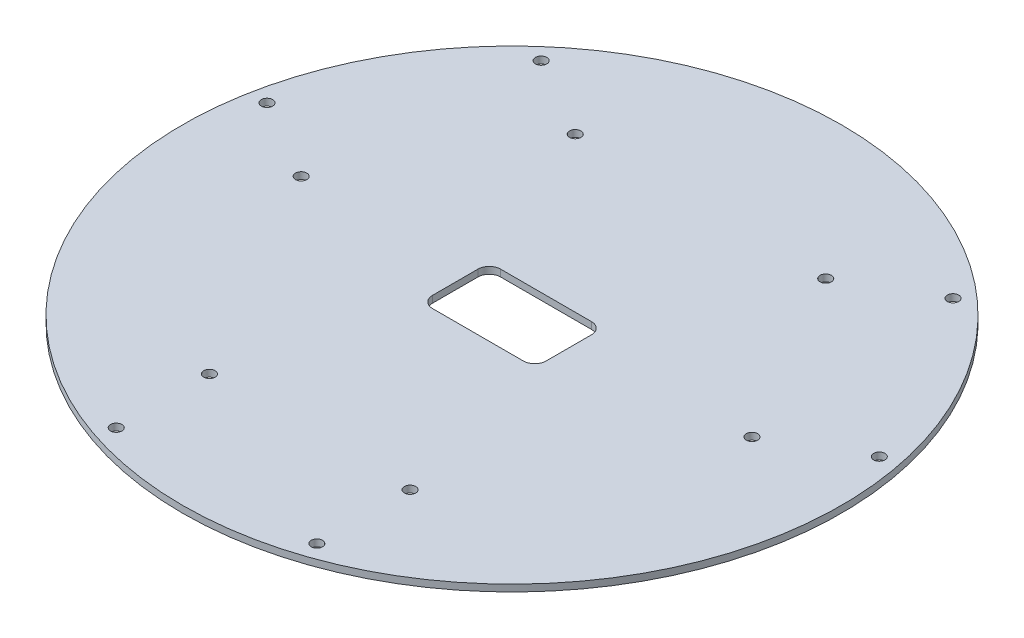
ISO-10303-21;
HEADER;
FILE_DESCRIPTION(('STEP AP214'),'2;1');
FILE_NAME('part.step','',(''),(''),'','','');
FILE_SCHEMA(('AUTOMOTIVE_DESIGN { 1 0 10303 214 1 1 1 1 }'));
ENDSEC;
DATA;
#1=APPLICATION_CONTEXT('core data for automotive mechanical design processes');
#2=APPLICATION_PROTOCOL_DEFINITION('international standard','automotive_design',2000,#1);
#3=PRODUCT_CONTEXT('',#1,'mechanical');
#4=PRODUCT('Part','Part','',(#3));
#5=PRODUCT_RELATED_PRODUCT_CATEGORY('part','',(#4));
#6=PRODUCT_DEFINITION_FORMATION('','',#4);
#7=PRODUCT_DEFINITION_CONTEXT('part definition',#1,'design');
#8=PRODUCT_DEFINITION('design','',#6,#7);
#9=PRODUCT_DEFINITION_SHAPE('','',#8);
#10=(LENGTH_UNIT() NAMED_UNIT(*) SI_UNIT(.MILLI.,.METRE.));
#11=(NAMED_UNIT(*) PLANE_ANGLE_UNIT() SI_UNIT($,.RADIAN.));
#12=(NAMED_UNIT(*) SI_UNIT($,.STERADIAN.) SOLID_ANGLE_UNIT());
#13=UNCERTAINTY_MEASURE_WITH_UNIT(LENGTH_MEASURE(1.E-05),#10,'distance_accuracy_value','');
#14=(GEOMETRIC_REPRESENTATION_CONTEXT(3) GLOBAL_UNCERTAINTY_ASSIGNED_CONTEXT((#13)) GLOBAL_UNIT_ASSIGNED_CONTEXT((#10,
#11,#12)) REPRESENTATION_CONTEXT('',''));
#15=CARTESIAN_POINT('',(0.,0.,0.));
#16=DIRECTION('',(0.,0.,1.));
#17=DIRECTION('',(1.,0.,0.));
#18=AXIS2_PLACEMENT_3D('',#15,#16,#17);
#19=CARTESIAN_POINT('',(0.,3.,0.));
#20=DIRECTION('',(0.,-1.,0.));
#21=DIRECTION('',(0.,0.,-1.));
#22=AXIS2_PLACEMENT_3D('',#19,#20,#21);
#23=CYLINDRICAL_SURFACE('',#22,145.);
#24=CARTESIAN_POINT('',(0.,3.,0.));
#25=DIRECTION('',(0.,1.,0.));
#26=DIRECTION('',(0.,0.,1.));
#27=AXIS2_PLACEMENT_3D('',#24,#25,#26);
#28=CIRCLE('',#27,145.);
#29=CARTESIAN_POINT('',(0.,3.,145.));
#30=VERTEX_POINT('',#29);
#31=EDGE_CURVE('E180',#30,#30,#28,.T.);
#32=ORIENTED_EDGE('',*,*,#31,.F.);
#33=EDGE_LOOP('',(#32));
#34=FACE_BOUND('',#33,.T.);
#35=CARTESIAN_POINT('',(0.,0.,0.));
#36=DIRECTION('',(0.,1.,0.));
#37=DIRECTION('',(0.,0.,1.));
#38=AXIS2_PLACEMENT_3D('',#35,#36,#37);
#39=CIRCLE('',#38,145.);
#40=CARTESIAN_POINT('',(0.,0.,145.));
#41=VERTEX_POINT('',#40);
#42=EDGE_CURVE('E184',#41,#41,#39,.T.);
#43=ORIENTED_EDGE('',*,*,#42,.T.);
#44=EDGE_LOOP('',(#43));
#45=FACE_BOUND('',#44,.T.);
#46=ADVANCED_FACE('F36',(#34,#45),#23,.T.);
#47=CARTESIAN_POINT('',(0.,3.,0.));
#48=DIRECTION('',(0.,1.,0.));
#49=DIRECTION('',(0.,0.,1.));
#50=AXIS2_PLACEMENT_3D('',#47,#48,#49);
#51=PLANE('',#50);
#52=DIRECTION('',(0.,0.,-1.));
#53=VECTOR('',#52,1.);
#54=CARTESIAN_POINT('',(25.,3.,-15.));
#55=LINE('',#54,#53);
#56=CARTESIAN_POINT('',(25.,3.,9.99999999999999));
#57=VERTEX_POINT('',#56);
#58=CARTESIAN_POINT('',(25.,3.,-10.));
#59=VERTEX_POINT('',#58);
#60=EDGE_CURVE('E132',#57,#59,#55,.T.);
#61=ORIENTED_EDGE('',*,*,#60,.F.);
#62=CARTESIAN_POINT('',(20.,3.,10.));
#63=DIRECTION('',(0.,1.,0.));
#64=DIRECTION('',(0.,0.,1.));
#65=AXIS2_PLACEMENT_3D('',#62,#63,#64);
#66=CIRCLE('',#65,5.);
#67=CARTESIAN_POINT('',(20.,3.,15.));
#68=VERTEX_POINT('',#67);
#69=EDGE_CURVE('E240',#57,#68,#66,.F.);
#70=ORIENTED_EDGE('',*,*,#69,.T.);
#71=DIRECTION('',(1.,0.,0.));
#72=VECTOR('',#71,1.);
#73=CARTESIAN_POINT('',(-25.,3.,15.));
#74=LINE('',#73,#72);
#75=CARTESIAN_POINT('',(-20.,3.,15.));
#76=VERTEX_POINT('',#75);
#77=EDGE_CURVE('E127',#76,#68,#74,.T.);
#78=ORIENTED_EDGE('',*,*,#77,.F.);
#79=CARTESIAN_POINT('',(-20.,3.,10.));
#80=DIRECTION('',(0.,1.,0.));
#81=DIRECTION('',(0.,0.,1.));
#82=AXIS2_PLACEMENT_3D('',#79,#80,#81);
#83=CIRCLE('',#82,5.);
#84=CARTESIAN_POINT('',(-25.,3.,10.));
#85=VERTEX_POINT('',#84);
#86=EDGE_CURVE('E44',#76,#85,#83,.F.);
#87=ORIENTED_EDGE('',*,*,#86,.T.);
#88=DIRECTION('',(0.,0.,1.));
#89=VECTOR('',#88,1.);
#90=CARTESIAN_POINT('',(-25.,3.,-15.));
#91=LINE('',#90,#89);
#92=CARTESIAN_POINT('',(-25.,3.,-10.));
#93=VERTEX_POINT('',#92);
#94=EDGE_CURVE('E117',#93,#85,#91,.T.);
#95=ORIENTED_EDGE('',*,*,#94,.F.);
#96=CARTESIAN_POINT('',(-20.,3.,-10.));
#97=DIRECTION('',(0.,1.,0.));
#98=DIRECTION('',(0.,0.,1.));
#99=AXIS2_PLACEMENT_3D('',#96,#97,#98);
#100=CIRCLE('',#99,5.);
#101=CARTESIAN_POINT('',(-20.,3.,-15.));
#102=VERTEX_POINT('',#101);
#103=EDGE_CURVE('E101',#93,#102,#100,.F.);
#104=ORIENTED_EDGE('',*,*,#103,.T.);
#105=DIRECTION('',(-1.,0.,0.));
#106=VECTOR('',#105,1.);
#107=CARTESIAN_POINT('',(-25.,3.,-15.));
#108=LINE('',#107,#106);
#109=CARTESIAN_POINT('',(20.,3.,-15.));
#110=VERTEX_POINT('',#109);
#111=EDGE_CURVE('E128',#110,#102,#108,.T.);
#112=ORIENTED_EDGE('',*,*,#111,.F.);
#113=CARTESIAN_POINT('',(20.,3.,-10.));
#114=DIRECTION('',(0.,1.,0.));
#115=DIRECTION('',(0.,0.,1.));
#116=AXIS2_PLACEMENT_3D('',#113,#114,#115);
#117=CIRCLE('',#116,5.);
#118=EDGE_CURVE('E236',#110,#59,#117,.F.);
#119=ORIENTED_EDGE('',*,*,#118,.T.);
#120=EDGE_LOOP('',(#61,#70,#78,#87,#95,#104,#112,#119));
#121=FACE_BOUND('',#120,.T.);
#122=CARTESIAN_POINT('',(134.746567452598,3.,-26.8527252769548));
#123=DIRECTION('',(0.,1.,0.));
#124=DIRECTION('',(0.866025403784436,0.,-0.500000000000004));
#125=AXIS2_PLACEMENT_3D('',#122,#123,#124);
#126=CIRCLE('',#125,2.5);
#127=CARTESIAN_POINT('',(136.911630962059,3.,-28.1027252769548));
#128=VERTEX_POINT('',#127);
#129=EDGE_CURVE('E136',#128,#128,#126,.T.);
#130=ORIENTED_EDGE('',*,*,#129,.F.);
#131=EDGE_LOOP('',(#130));
#132=FACE_BOUND('',#131,.T.);
#133=CARTESIAN_POINT('',(-55.0256194612035,3.,-82.8423443212064));
#134=DIRECTION('',(0.,1.,0.));
#135=DIRECTION('',(-0.866025403784443,0.,-0.499999999999992));
#136=AXIS2_PLACEMENT_3D('',#133,#134,#135);
#137=CIRCLE('',#136,2.5);
#138=CARTESIAN_POINT('',(-57.1906829706646,3.,-84.0923443212064));
#139=VERTEX_POINT('',#138);
#140=EDGE_CURVE('E130',#139,#139,#137,.T.);
#141=ORIENTED_EDGE('',*,*,#140,.F.);
#142=EDGE_LOOP('',(#141));
#143=FACE_BOUND('',#142,.T.);
#144=CARTESIAN_POINT('',(-90.5326610163657,3.,-103.342344321206));
#145=DIRECTION('',(0.,1.,0.));
#146=DIRECTION('',(-0.866025403784443,0.,-0.499999999999992));
#147=AXIS2_PLACEMENT_3D('',#144,#145,#146);
#148=CIRCLE('',#147,2.5);
#149=CARTESIAN_POINT('',(-92.6977245258268,3.,-104.592344321206));
#150=VERTEX_POINT('',#149);
#151=EDGE_CURVE('E143',#150,#150,#148,.T.);
#152=ORIENTED_EDGE('',*,*,#151,.F.);
#153=EDGE_LOOP('',(#152));
#154=FACE_BOUND('',#153,.T.);
#155=CARTESIAN_POINT('',(99.2395258974363,3.,-6.35272527695467));
#156=DIRECTION('',(0.,1.,0.));
#157=DIRECTION('',(0.866025403784436,0.,-0.500000000000004));
#158=AXIS2_PLACEMENT_3D('',#155,#156,#157);
#159=CIRCLE('',#158,2.5);
#160=CARTESIAN_POINT('',(101.404589406897,3.,-7.60272527695468));
#161=VERTEX_POINT('',#160);
#162=EDGE_CURVE('E140',#161,#161,#159,.T.);
#163=ORIENTED_EDGE('',*,*,#162,.F.);
#164=EDGE_LOOP('',(#163));
#165=FACE_BOUND('',#164,.T.);
#166=CARTESIAN_POINT('',(-134.763695089256,3.,-26.9735045182583));
#167=DIRECTION('',(0.,-1.,0.));
#168=DIRECTION('',(-0.866025403784443,0.,-0.499999999999992));
#169=AXIS2_PLACEMENT_3D('',#166,#167,#168);
#170=CIRCLE('',#169,2.5);
#171=CARTESIAN_POINT('',(-136.928758598717,3.,-28.2235045182582));
#172=VERTEX_POINT('',#171);
#173=EDGE_CURVE('E148',#172,#172,#170,.T.);
#174=ORIENTED_EDGE('',*,*,#173,.T.);
#175=EDGE_LOOP('',(#174));
#176=FACE_BOUND('',#175,.T.);
#177=CARTESIAN_POINT('',(-99.2566535340941,3.,-6.47350451825859));
#178=DIRECTION('',(0.,-1.,0.));
#179=DIRECTION('',(-0.866025403784443,0.,-0.499999999999992));
#180=AXIS2_PLACEMENT_3D('',#177,#178,#179);
#181=CIRCLE('',#180,2.5);
#182=CARTESIAN_POINT('',(-101.421717043555,3.,-7.72350451825857));
#183=VERTEX_POINT('',#182);
#184=EDGE_CURVE('E152',#183,#183,#181,.T.);
#185=ORIENTED_EDGE('',*,*,#184,.T.);
#186=EDGE_LOOP('',(#185));
#187=FACE_BOUND('',#186,.T.);
#188=CARTESIAN_POINT('',(90.6286950892556,3.,-103.417566910312));
#189=DIRECTION('',(0.,-1.,0.));
#190=DIRECTION('',(0.866025403784436,0.,-0.500000000000004));
#191=AXIS2_PLACEMENT_3D('',#188,#189,#190);
#192=CIRCLE('',#191,2.5);
#193=CARTESIAN_POINT('',(92.7937585987167,3.,-104.667566910312));
#194=VERTEX_POINT('',#193);
#195=EDGE_CURVE('E156',#194,#194,#192,.T.);
#196=ORIENTED_EDGE('',*,*,#195,.T.);
#197=EDGE_LOOP('',(#196));
#198=FACE_BOUND('',#197,.T.);
#199=CARTESIAN_POINT('',(55.1216535340937,3.,-82.9175669103122));
#200=DIRECTION('',(0.,-1.,0.));
#201=DIRECTION('',(0.866025403784436,0.,-0.500000000000004));
#202=AXIS2_PLACEMENT_3D('',#199,#200,#201);
#203=CIRCLE('',#202,2.5);
#204=CARTESIAN_POINT('',(57.2867170435548,3.,-84.1675669103122));
#205=VERTEX_POINT('',#204);
#206=EDGE_CURVE('E160',#205,#205,#203,.T.);
#207=ORIENTED_EDGE('',*,*,#206,.T.);
#208=EDGE_LOOP('',(#207));
#209=FACE_BOUND('',#208,.T.);
#210=CARTESIAN_POINT('',(44.135,3.,130.));
#211=DIRECTION('',(0.,-1.,0.));
#212=DIRECTION('',(0.,0.,1.));
#213=AXIS2_PLACEMENT_3D('',#210,#211,#212);
#214=CIRCLE('',#213,2.5);
#215=CARTESIAN_POINT('',(44.135,3.,132.5));
#216=VERTEX_POINT('',#215);
#217=EDGE_CURVE('E164',#216,#216,#214,.T.);
#218=ORIENTED_EDGE('',*,*,#217,.T.);
#219=EDGE_LOOP('',(#218));
#220=FACE_BOUND('',#219,.T.);
#221=CARTESIAN_POINT('',(44.135,3.,89.));
#222=DIRECTION('',(0.,-1.,0.));
#223=DIRECTION('',(0.,0.,1.));
#224=AXIS2_PLACEMENT_3D('',#221,#222,#223);
#225=CIRCLE('',#224,2.5);
#226=CARTESIAN_POINT('',(44.135,3.,91.5));
#227=VERTEX_POINT('',#226);
#228=EDGE_CURVE('E168',#227,#227,#225,.T.);
#229=ORIENTED_EDGE('',*,*,#228,.T.);
#230=EDGE_LOOP('',(#229));
#231=FACE_BOUND('',#230,.T.);
#232=CARTESIAN_POINT('',(-44.135,3.,130.));
#233=DIRECTION('',(0.,1.,0.));
#234=DIRECTION('',(0.,0.,1.));
#235=AXIS2_PLACEMENT_3D('',#232,#233,#234);
#236=CIRCLE('',#235,2.5);
#237=CARTESIAN_POINT('',(-44.135,3.,132.5));
#238=VERTEX_POINT('',#237);
#239=EDGE_CURVE('E172',#238,#238,#236,.T.);
#240=ORIENTED_EDGE('',*,*,#239,.F.);
#241=EDGE_LOOP('',(#240));
#242=FACE_BOUND('',#241,.T.);
#243=CARTESIAN_POINT('',(-44.135,3.,89.));
#244=DIRECTION('',(0.,1.,0.));
#245=DIRECTION('',(0.,0.,1.));
#246=AXIS2_PLACEMENT_3D('',#243,#244,#245);
#247=CIRCLE('',#246,2.5);
#248=CARTESIAN_POINT('',(-44.135,3.,91.5));
#249=VERTEX_POINT('',#248);
#250=EDGE_CURVE('E176',#249,#249,#247,.T.);
#251=ORIENTED_EDGE('',*,*,#250,.F.);
#252=EDGE_LOOP('',(#251));
#253=FACE_BOUND('',#252,.T.);
#254=ORIENTED_EDGE('',*,*,#31,.T.);
#255=EDGE_LOOP('',(#254));
#256=FACE_BOUND('',#255,.T.);
#257=ADVANCED_FACE('F124',(#121,#132,#143,#154,#165,#176,#187,#198,#209,#220,#231,#242,#253,
#256),#51,.T.);
#258=CARTESIAN_POINT('',(0.,0.,0.));
#259=DIRECTION('',(0.,1.,0.));
#260=DIRECTION('',(0.,0.,1.));
#261=AXIS2_PLACEMENT_3D('',#258,#259,#260);
#262=PLANE('',#261);
#263=DIRECTION('',(0.,0.,1.));
#264=VECTOR('',#263,1.);
#265=CARTESIAN_POINT('',(-25.,0.,0.));
#266=LINE('',#265,#264);
#267=CARTESIAN_POINT('',(-25.,0.,-10.));
#268=VERTEX_POINT('',#267);
#269=CARTESIAN_POINT('',(-25.,0.,10.));
#270=VERTEX_POINT('',#269);
#271=EDGE_CURVE('E119',#268,#270,#266,.T.);
#272=ORIENTED_EDGE('',*,*,#271,.T.);
#273=CARTESIAN_POINT('',(-20.,0.,10.));
#274=DIRECTION('',(0.,1.,0.));
#275=DIRECTION('',(0.,0.,1.));
#276=AXIS2_PLACEMENT_3D('',#273,#274,#275);
#277=CIRCLE('',#276,5.);
#278=CARTESIAN_POINT('',(-20.,0.,15.));
#279=VERTEX_POINT('',#278);
#280=EDGE_CURVE('E11',#270,#279,#277,.T.);
#281=ORIENTED_EDGE('',*,*,#280,.T.);
#282=DIRECTION('',(1.,0.,0.));
#283=VECTOR('',#282,1.);
#284=CARTESIAN_POINT('',(0.,0.,15.));
#285=LINE('',#284,#283);
#286=CARTESIAN_POINT('',(20.,0.,15.));
#287=VERTEX_POINT('',#286);
#288=EDGE_CURVE('E217',#279,#287,#285,.T.);
#289=ORIENTED_EDGE('',*,*,#288,.T.);
#290=CARTESIAN_POINT('',(20.,0.,10.));
#291=DIRECTION('',(0.,1.,0.));
#292=DIRECTION('',(0.,0.,1.));
#293=AXIS2_PLACEMENT_3D('',#290,#291,#292);
#294=CIRCLE('',#293,5.);
#295=CARTESIAN_POINT('',(25.,0.,9.99999999999999));
#296=VERTEX_POINT('',#295);
#297=EDGE_CURVE('E242',#287,#296,#294,.T.);
#298=ORIENTED_EDGE('',*,*,#297,.T.);
#299=DIRECTION('',(0.,0.,-1.));
#300=VECTOR('',#299,1.);
#301=CARTESIAN_POINT('',(25.,0.,0.));
#302=LINE('',#301,#300);
#303=CARTESIAN_POINT('',(25.,0.,-10.));
#304=VERTEX_POINT('',#303);
#305=EDGE_CURVE('E219',#296,#304,#302,.T.);
#306=ORIENTED_EDGE('',*,*,#305,.T.);
#307=CARTESIAN_POINT('',(20.,0.,-10.));
#308=DIRECTION('',(0.,1.,0.));
#309=DIRECTION('',(0.,0.,1.));
#310=AXIS2_PLACEMENT_3D('',#307,#308,#309);
#311=CIRCLE('',#310,5.);
#312=CARTESIAN_POINT('',(20.,0.,-15.));
#313=VERTEX_POINT('',#312);
#314=EDGE_CURVE('E238',#304,#313,#311,.T.);
#315=ORIENTED_EDGE('',*,*,#314,.T.);
#316=DIRECTION('',(-1.,0.,0.));
#317=VECTOR('',#316,1.);
#318=CARTESIAN_POINT('',(0.,0.,-15.));
#319=LINE('',#318,#317);
#320=CARTESIAN_POINT('',(-20.,0.,-15.));
#321=VERTEX_POINT('',#320);
#322=EDGE_CURVE('E183',#313,#321,#319,.T.);
#323=ORIENTED_EDGE('',*,*,#322,.T.);
#324=CARTESIAN_POINT('',(-20.,0.,-10.));
#325=DIRECTION('',(0.,1.,0.));
#326=DIRECTION('',(0.,0.,1.));
#327=AXIS2_PLACEMENT_3D('',#324,#325,#326);
#328=CIRCLE('',#327,5.);
#329=EDGE_CURVE('E111',#321,#268,#328,.T.);
#330=ORIENTED_EDGE('',*,*,#329,.T.);
#331=EDGE_LOOP('',(#272,#281,#289,#298,#306,#315,#323,#330));
#332=FACE_BOUND('',#331,.T.);
#333=CARTESIAN_POINT('',(134.746567452598,0.,-26.8527252769548));
#334=DIRECTION('',(0.,1.,0.));
#335=DIRECTION('',(0.,0.,1.));
#336=AXIS2_PLACEMENT_3D('',#333,#334,#335);
#337=CIRCLE('',#336,2.5);
#338=CARTESIAN_POINT('',(134.746567452598,0.,-24.3527252769548));
#339=VERTEX_POINT('',#338);
#340=EDGE_CURVE('E155',#339,#339,#337,.T.);
#341=ORIENTED_EDGE('',*,*,#340,.T.);
#342=EDGE_LOOP('',(#341));
#343=FACE_BOUND('',#342,.T.);
#344=CARTESIAN_POINT('',(-55.0256194612035,0.,-82.8423443212064));
#345=DIRECTION('',(0.,1.,0.));
#346=DIRECTION('',(0.,0.,1.));
#347=AXIS2_PLACEMENT_3D('',#344,#345,#346);
#348=CIRCLE('',#347,2.5);
#349=CARTESIAN_POINT('',(-55.0256194612035,0.,-80.3423443212064));
#350=VERTEX_POINT('',#349);
#351=EDGE_CURVE('E209',#350,#350,#348,.T.);
#352=ORIENTED_EDGE('',*,*,#351,.T.);
#353=EDGE_LOOP('',(#352));
#354=FACE_BOUND('',#353,.T.);
#355=CARTESIAN_POINT('',(-90.5326610163657,0.,-103.342344321206));
#356=DIRECTION('',(0.,1.,0.));
#357=DIRECTION('',(0.,0.,1.));
#358=AXIS2_PLACEMENT_3D('',#355,#356,#357);
#359=CIRCLE('',#358,2.5);
#360=CARTESIAN_POINT('',(-90.5326610163657,0.,-100.842344321206));
#361=VERTEX_POINT('',#360);
#362=EDGE_CURVE('E206',#361,#361,#359,.T.);
#363=ORIENTED_EDGE('',*,*,#362,.T.);
#364=EDGE_LOOP('',(#363));
#365=FACE_BOUND('',#364,.T.);
#366=CARTESIAN_POINT('',(99.2395258974363,0.,-6.35272527695467));
#367=DIRECTION('',(0.,1.,0.));
#368=DIRECTION('',(0.,0.,1.));
#369=AXIS2_PLACEMENT_3D('',#366,#367,#368);
#370=CIRCLE('',#369,2.5);
#371=CARTESIAN_POINT('',(99.2395258974363,0.,-3.85272527695466));
#372=VERTEX_POINT('',#371);
#373=EDGE_CURVE('E139',#372,#372,#370,.T.);
#374=ORIENTED_EDGE('',*,*,#373,.T.);
#375=EDGE_LOOP('',(#374));
#376=FACE_BOUND('',#375,.T.);
#377=CARTESIAN_POINT('',(-134.763695089256,0.,-26.9735045182583));
#378=DIRECTION('',(0.,1.,0.));
#379=DIRECTION('',(0.,0.,1.));
#380=AXIS2_PLACEMENT_3D('',#377,#378,#379);
#381=CIRCLE('',#380,2.5);
#382=CARTESIAN_POINT('',(-134.763695089256,0.,-24.4735045182583));
#383=VERTEX_POINT('',#382);
#384=EDGE_CURVE('E163',#383,#383,#381,.F.);
#385=ORIENTED_EDGE('',*,*,#384,.F.);
#386=EDGE_LOOP('',(#385));
#387=FACE_BOUND('',#386,.T.);
#388=CARTESIAN_POINT('',(-99.2566535340941,0.,-6.47350451825859));
#389=DIRECTION('',(0.,1.,0.));
#390=DIRECTION('',(0.,0.,1.));
#391=AXIS2_PLACEMENT_3D('',#388,#389,#390);
#392=CIRCLE('',#391,2.5);
#393=CARTESIAN_POINT('',(-99.2566535340941,0.,-3.97350451825859));
#394=VERTEX_POINT('',#393);
#395=EDGE_CURVE('E151',#394,#394,#392,.F.);
#396=ORIENTED_EDGE('',*,*,#395,.F.);
#397=EDGE_LOOP('',(#396));
#398=FACE_BOUND('',#397,.T.);
#399=CARTESIAN_POINT('',(90.6286950892556,0.,-103.417566910312));
#400=DIRECTION('',(0.,1.,0.));
#401=DIRECTION('',(0.,0.,1.));
#402=AXIS2_PLACEMENT_3D('',#399,#400,#401);
#403=CIRCLE('',#402,2.5);
#404=CARTESIAN_POINT('',(90.6286950892556,0.,-100.917566910312));
#405=VERTEX_POINT('',#404);
#406=EDGE_CURVE('E171',#405,#405,#403,.F.);
#407=ORIENTED_EDGE('',*,*,#406,.F.);
#408=EDGE_LOOP('',(#407));
#409=FACE_BOUND('',#408,.T.);
#410=CARTESIAN_POINT('',(55.1216535340937,0.,-82.9175669103122));
#411=DIRECTION('',(0.,1.,0.));
#412=DIRECTION('',(0.,0.,1.));
#413=AXIS2_PLACEMENT_3D('',#410,#411,#412);
#414=CIRCLE('',#413,2.5);
#415=CARTESIAN_POINT('',(55.1216535340937,0.,-80.4175669103122));
#416=VERTEX_POINT('',#415);
#417=EDGE_CURVE('E159',#416,#416,#414,.F.);
#418=ORIENTED_EDGE('',*,*,#417,.F.);
#419=EDGE_LOOP('',(#418));
#420=FACE_BOUND('',#419,.T.);
#421=CARTESIAN_POINT('',(44.135,0.,130.));
#422=DIRECTION('',(0.,1.,0.));
#423=DIRECTION('',(0.,0.,1.));
#424=AXIS2_PLACEMENT_3D('',#421,#422,#423);
#425=CIRCLE('',#424,2.5);
#426=CARTESIAN_POINT('',(44.135,0.,132.5));
#427=VERTEX_POINT('',#426);
#428=EDGE_CURVE('E179',#427,#427,#425,.F.);
#429=ORIENTED_EDGE('',*,*,#428,.F.);
#430=EDGE_LOOP('',(#429));
#431=FACE_BOUND('',#430,.T.);
#432=CARTESIAN_POINT('',(44.135,0.,89.));
#433=DIRECTION('',(0.,1.,0.));
#434=DIRECTION('',(0.,0.,1.));
#435=AXIS2_PLACEMENT_3D('',#432,#433,#434);
#436=CIRCLE('',#435,2.5);
#437=CARTESIAN_POINT('',(44.135,0.,91.5));
#438=VERTEX_POINT('',#437);
#439=EDGE_CURVE('E167',#438,#438,#436,.F.);
#440=ORIENTED_EDGE('',*,*,#439,.F.);
#441=EDGE_LOOP('',(#440));
#442=FACE_BOUND('',#441,.T.);
#443=CARTESIAN_POINT('',(-44.135,0.,130.));
#444=DIRECTION('',(0.,1.,0.));
#445=DIRECTION('',(0.,0.,1.));
#446=AXIS2_PLACEMENT_3D('',#443,#444,#445);
#447=CIRCLE('',#446,2.5);
#448=CARTESIAN_POINT('',(-44.135,0.,132.5));
#449=VERTEX_POINT('',#448);
#450=EDGE_CURVE('E187',#449,#449,#447,.T.);
#451=ORIENTED_EDGE('',*,*,#450,.T.);
#452=EDGE_LOOP('',(#451));
#453=FACE_BOUND('',#452,.T.);
#454=CARTESIAN_POINT('',(-44.135,0.,89.));
#455=DIRECTION('',(0.,1.,0.));
#456=DIRECTION('',(0.,0.,1.));
#457=AXIS2_PLACEMENT_3D('',#454,#455,#456);
#458=CIRCLE('',#457,2.5);
#459=CARTESIAN_POINT('',(-44.135,0.,91.5));
#460=VERTEX_POINT('',#459);
#461=EDGE_CURVE('E175',#460,#460,#458,.T.);
#462=ORIENTED_EDGE('',*,*,#461,.T.);
#463=EDGE_LOOP('',(#462));
#464=FACE_BOUND('',#463,.T.);
#465=ORIENTED_EDGE('',*,*,#42,.F.);
#466=EDGE_LOOP('',(#465));
#467=FACE_BOUND('',#466,.T.);
#468=ADVANCED_FACE('F245',(#332,#343,#354,#365,#376,#387,#398,#409,#420,#431,#442,#453,#464,
#467),#262,.F.);
#469=CARTESIAN_POINT('',(-44.135,-7.,89.));
#470=DIRECTION('',(0.,1.,0.));
#471=DIRECTION('',(0.,0.,1.));
#472=AXIS2_PLACEMENT_3D('',#469,#470,#471);
#473=CYLINDRICAL_SURFACE('',#472,2.5);
#474=ORIENTED_EDGE('',*,*,#250,.T.);
#475=EDGE_LOOP('',(#474));
#476=FACE_BOUND('',#475,.T.);
#477=ORIENTED_EDGE('',*,*,#461,.F.);
#478=EDGE_LOOP('',(#477));
#479=FACE_BOUND('',#478,.T.);
#480=ADVANCED_FACE('F282',(#476,#479),#473,.F.);
#481=CARTESIAN_POINT('',(-44.135,-7.,130.));
#482=DIRECTION('',(0.,1.,0.));
#483=DIRECTION('',(0.,0.,1.));
#484=AXIS2_PLACEMENT_3D('',#481,#482,#483);
#485=CYLINDRICAL_SURFACE('',#484,2.5);
#486=ORIENTED_EDGE('',*,*,#239,.T.);
#487=EDGE_LOOP('',(#486));
#488=FACE_BOUND('',#487,.T.);
#489=ORIENTED_EDGE('',*,*,#450,.F.);
#490=EDGE_LOOP('',(#489));
#491=FACE_BOUND('',#490,.T.);
#492=ADVANCED_FACE('F286',(#488,#491),#485,.F.);
#493=CARTESIAN_POINT('',(44.135,-7.,89.));
#494=DIRECTION('',(0.,1.,0.));
#495=DIRECTION('',(0.,0.,1.));
#496=AXIS2_PLACEMENT_3D('',#493,#494,#495);
#497=CYLINDRICAL_SURFACE('',#496,2.5);
#498=ORIENTED_EDGE('',*,*,#228,.F.);
#499=EDGE_LOOP('',(#498));
#500=FACE_BOUND('',#499,.T.);
#501=ORIENTED_EDGE('',*,*,#439,.T.);
#502=EDGE_LOOP('',(#501));
#503=FACE_BOUND('',#502,.T.);
#504=ADVANCED_FACE('F290',(#500,#503),#497,.F.);
#505=CARTESIAN_POINT('',(44.135,-7.,130.));
#506=DIRECTION('',(0.,1.,0.));
#507=DIRECTION('',(0.,0.,1.));
#508=AXIS2_PLACEMENT_3D('',#505,#506,#507);
#509=CYLINDRICAL_SURFACE('',#508,2.5);
#510=ORIENTED_EDGE('',*,*,#217,.F.);
#511=EDGE_LOOP('',(#510));
#512=FACE_BOUND('',#511,.T.);
#513=ORIENTED_EDGE('',*,*,#428,.T.);
#514=EDGE_LOOP('',(#513));
#515=FACE_BOUND('',#514,.T.);
#516=ADVANCED_FACE('F294',(#512,#515),#509,.F.);
#517=CARTESIAN_POINT('',(55.1216535340937,-7.,-82.9175669103122));
#518=DIRECTION('',(0.,1.,0.));
#519=DIRECTION('',(0.,0.,1.));
#520=AXIS2_PLACEMENT_3D('',#517,#518,#519);
#521=CYLINDRICAL_SURFACE('',#520,2.5);
#522=ORIENTED_EDGE('',*,*,#206,.F.);
#523=EDGE_LOOP('',(#522));
#524=FACE_BOUND('',#523,.T.);
#525=ORIENTED_EDGE('',*,*,#417,.T.);
#526=EDGE_LOOP('',(#525));
#527=FACE_BOUND('',#526,.T.);
#528=ADVANCED_FACE('F298',(#524,#527),#521,.F.);
#529=CARTESIAN_POINT('',(90.6286950892556,-7.,-103.417566910312));
#530=DIRECTION('',(0.,1.,0.));
#531=DIRECTION('',(0.,0.,1.));
#532=AXIS2_PLACEMENT_3D('',#529,#530,#531);
#533=CYLINDRICAL_SURFACE('',#532,2.5);
#534=ORIENTED_EDGE('',*,*,#195,.F.);
#535=EDGE_LOOP('',(#534));
#536=FACE_BOUND('',#535,.T.);
#537=ORIENTED_EDGE('',*,*,#406,.T.);
#538=EDGE_LOOP('',(#537));
#539=FACE_BOUND('',#538,.T.);
#540=ADVANCED_FACE('F302',(#536,#539),#533,.F.);
#541=CARTESIAN_POINT('',(-99.2566535340941,-7.,-6.47350451825859));
#542=DIRECTION('',(0.,1.,0.));
#543=DIRECTION('',(0.,0.,1.));
#544=AXIS2_PLACEMENT_3D('',#541,#542,#543);
#545=CYLINDRICAL_SURFACE('',#544,2.5);
#546=ORIENTED_EDGE('',*,*,#184,.F.);
#547=EDGE_LOOP('',(#546));
#548=FACE_BOUND('',#547,.T.);
#549=ORIENTED_EDGE('',*,*,#395,.T.);
#550=EDGE_LOOP('',(#549));
#551=FACE_BOUND('',#550,.T.);
#552=ADVANCED_FACE('F306',(#548,#551),#545,.F.);
#553=CARTESIAN_POINT('',(-134.763695089256,-7.,-26.9735045182583));
#554=DIRECTION('',(0.,1.,0.));
#555=DIRECTION('',(0.,0.,1.));
#556=AXIS2_PLACEMENT_3D('',#553,#554,#555);
#557=CYLINDRICAL_SURFACE('',#556,2.5);
#558=ORIENTED_EDGE('',*,*,#173,.F.);
#559=EDGE_LOOP('',(#558));
#560=FACE_BOUND('',#559,.T.);
#561=ORIENTED_EDGE('',*,*,#384,.T.);
#562=EDGE_LOOP('',(#561));
#563=FACE_BOUND('',#562,.T.);
#564=ADVANCED_FACE('F310',(#560,#563),#557,.F.);
#565=CARTESIAN_POINT('',(99.2395258974363,-7.,-6.35272527695467));
#566=DIRECTION('',(0.,1.,0.));
#567=DIRECTION('',(0.,0.,1.));
#568=AXIS2_PLACEMENT_3D('',#565,#566,#567);
#569=CYLINDRICAL_SURFACE('',#568,2.5);
#570=ORIENTED_EDGE('',*,*,#162,.T.);
#571=EDGE_LOOP('',(#570));
#572=FACE_BOUND('',#571,.T.);
#573=ORIENTED_EDGE('',*,*,#373,.F.);
#574=EDGE_LOOP('',(#573));
#575=FACE_BOUND('',#574,.T.);
#576=ADVANCED_FACE('F314',(#572,#575),#569,.F.);
#577=CARTESIAN_POINT('',(-90.5326610163657,-7.,-103.342344321206));
#578=DIRECTION('',(0.,1.,0.));
#579=DIRECTION('',(0.,0.,1.));
#580=AXIS2_PLACEMENT_3D('',#577,#578,#579);
#581=CYLINDRICAL_SURFACE('',#580,2.5);
#582=ORIENTED_EDGE('',*,*,#151,.T.);
#583=EDGE_LOOP('',(#582));
#584=FACE_BOUND('',#583,.T.);
#585=ORIENTED_EDGE('',*,*,#362,.F.);
#586=EDGE_LOOP('',(#585));
#587=FACE_BOUND('',#586,.T.);
#588=ADVANCED_FACE('F316',(#584,#587),#581,.F.);
#589=CARTESIAN_POINT('',(-55.0256194612035,-7.,-82.8423443212064));
#590=DIRECTION('',(0.,1.,0.));
#591=DIRECTION('',(0.,0.,1.));
#592=AXIS2_PLACEMENT_3D('',#589,#590,#591);
#593=CYLINDRICAL_SURFACE('',#592,2.5);
#594=ORIENTED_EDGE('',*,*,#140,.T.);
#595=EDGE_LOOP('',(#594));
#596=FACE_BOUND('',#595,.T.);
#597=ORIENTED_EDGE('',*,*,#351,.F.);
#598=EDGE_LOOP('',(#597));
#599=FACE_BOUND('',#598,.T.);
#600=ADVANCED_FACE('F319',(#596,#599),#593,.F.);
#601=CARTESIAN_POINT('',(134.746567452598,-7.,-26.8527252769548));
#602=DIRECTION('',(0.,1.,0.));
#603=DIRECTION('',(0.,0.,1.));
#604=AXIS2_PLACEMENT_3D('',#601,#602,#603);
#605=CYLINDRICAL_SURFACE('',#604,2.5);
#606=ORIENTED_EDGE('',*,*,#129,.T.);
#607=EDGE_LOOP('',(#606));
#608=FACE_BOUND('',#607,.T.);
#609=ORIENTED_EDGE('',*,*,#340,.F.);
#610=EDGE_LOOP('',(#609));
#611=FACE_BOUND('',#610,.T.);
#612=ADVANCED_FACE('F326',(#608,#611),#605,.F.);
#613=CARTESIAN_POINT('',(25.,-7.,-15.));
#614=DIRECTION('',(1.,0.,0.));
#615=DIRECTION('',(0.,0.,-1.));
#616=AXIS2_PLACEMENT_3D('',#613,#614,#615);
#617=PLANE('',#616);
#618=ORIENTED_EDGE('',*,*,#60,.T.);
#619=DIRECTION('',(0.,1.,0.));
#620=VECTOR('',#619,1.);
#621=CARTESIAN_POINT('',(25.,0.,-10.));
#622=LINE('',#621,#620);
#623=EDGE_CURVE('E229',#59,#304,#622,.F.);
#624=ORIENTED_EDGE('',*,*,#623,.T.);
#625=ORIENTED_EDGE('',*,*,#305,.F.);
#626=DIRECTION('',(0.,1.,0.));
#627=VECTOR('',#626,1.);
#628=CARTESIAN_POINT('',(25.,3.,9.99999999999999));
#629=LINE('',#628,#627);
#630=EDGE_CURVE('E226',#296,#57,#629,.T.);
#631=ORIENTED_EDGE('',*,*,#630,.T.);
#632=EDGE_LOOP('',(#618,#624,#625,#631));
#633=FACE_BOUND('',#632,.T.);
#634=ADVANCED_FACE('F252',(#633),#617,.F.);
#635=CARTESIAN_POINT('',(-25.,-7.,15.));
#636=DIRECTION('',(0.,0.,1.));
#637=DIRECTION('',(1.,0.,0.));
#638=AXIS2_PLACEMENT_3D('',#635,#636,#637);
#639=PLANE('',#638);
#640=ORIENTED_EDGE('',*,*,#77,.T.);
#641=DIRECTION('',(0.,1.,0.));
#642=VECTOR('',#641,1.);
#643=CARTESIAN_POINT('',(20.,0.,15.));
#644=LINE('',#643,#642);
#645=EDGE_CURVE('E51',#68,#287,#644,.F.);
#646=ORIENTED_EDGE('',*,*,#645,.T.);
#647=ORIENTED_EDGE('',*,*,#288,.F.);
#648=DIRECTION('',(0.,1.,0.));
#649=VECTOR('',#648,1.);
#650=CARTESIAN_POINT('',(-20.,3.,15.));
#651=LINE('',#650,#649);
#652=EDGE_CURVE('E231',#279,#76,#651,.T.);
#653=ORIENTED_EDGE('',*,*,#652,.T.);
#654=EDGE_LOOP('',(#640,#646,#647,#653));
#655=FACE_BOUND('',#654,.T.);
#656=ADVANCED_FACE('F255',(#655),#639,.F.);
#657=CARTESIAN_POINT('',(-25.,-7.,-15.));
#658=DIRECTION('',(-1.,0.,0.));
#659=DIRECTION('',(0.,0.,1.));
#660=AXIS2_PLACEMENT_3D('',#657,#658,#659);
#661=PLANE('',#660);
#662=ORIENTED_EDGE('',*,*,#271,.F.);
#663=DIRECTION('',(0.,1.,0.));
#664=VECTOR('',#663,1.);
#665=CARTESIAN_POINT('',(-25.,3.,-10.));
#666=LINE('',#665,#664);
#667=EDGE_CURVE('E105',#268,#93,#666,.T.);
#668=ORIENTED_EDGE('',*,*,#667,.T.);
#669=ORIENTED_EDGE('',*,*,#94,.T.);
#670=DIRECTION('',(0.,1.,0.));
#671=VECTOR('',#670,1.);
#672=CARTESIAN_POINT('',(-25.,0.,10.));
#673=LINE('',#672,#671);
#674=EDGE_CURVE('E121',#85,#270,#673,.F.);
#675=ORIENTED_EDGE('',*,*,#674,.T.);
#676=EDGE_LOOP('',(#662,#668,#669,#675));
#677=FACE_BOUND('',#676,.T.);
#678=ADVANCED_FACE('F116',(#677),#661,.F.);
#679=CARTESIAN_POINT('',(-25.,-7.,-15.));
#680=DIRECTION('',(0.,0.,-1.));
#681=DIRECTION('',(-1.,0.,0.));
#682=AXIS2_PLACEMENT_3D('',#679,#680,#681);
#683=PLANE('',#682);
#684=ORIENTED_EDGE('',*,*,#111,.T.);
#685=DIRECTION('',(0.,1.,0.));
#686=VECTOR('',#685,1.);
#687=CARTESIAN_POINT('',(-20.,0.,-15.));
#688=LINE('',#687,#686);
#689=EDGE_CURVE('E106',#102,#321,#688,.F.);
#690=ORIENTED_EDGE('',*,*,#689,.T.);
#691=ORIENTED_EDGE('',*,*,#322,.F.);
#692=DIRECTION('',(0.,1.,0.));
#693=VECTOR('',#692,1.);
#694=CARTESIAN_POINT('',(20.,3.,-15.));
#695=LINE('',#694,#693);
#696=EDGE_CURVE('E120',#313,#110,#695,.T.);
#697=ORIENTED_EDGE('',*,*,#696,.T.);
#698=EDGE_LOOP('',(#684,#690,#691,#697));
#699=FACE_BOUND('',#698,.T.);
#700=ADVANCED_FACE('F261',(#699),#683,.F.);
#701=CARTESIAN_POINT('',(-20.,-7.,-10.));
#702=DIRECTION('',(0.,-1.,0.));
#703=DIRECTION('',(0.,0.,-1.));
#704=AXIS2_PLACEMENT_3D('',#701,#702,#703);
#705=CYLINDRICAL_SURFACE('',#704,5.);
#706=ORIENTED_EDGE('',*,*,#329,.F.);
#707=ORIENTED_EDGE('',*,*,#689,.F.);
#708=ORIENTED_EDGE('',*,*,#103,.F.);
#709=ORIENTED_EDGE('',*,*,#667,.F.);
#710=EDGE_LOOP('',(#706,#707,#708,#709));
#711=FACE_BOUND('',#710,.T.);
#712=ADVANCED_FACE('F104',(#711),#705,.F.);
#713=CARTESIAN_POINT('',(20.,-7.,-10.));
#714=DIRECTION('',(0.,-1.,0.));
#715=DIRECTION('',(0.,0.,-1.));
#716=AXIS2_PLACEMENT_3D('',#713,#714,#715);
#717=CYLINDRICAL_SURFACE('',#716,5.);
#718=ORIENTED_EDGE('',*,*,#314,.F.);
#719=ORIENTED_EDGE('',*,*,#623,.F.);
#720=ORIENTED_EDGE('',*,*,#118,.F.);
#721=ORIENTED_EDGE('',*,*,#696,.F.);
#722=EDGE_LOOP('',(#718,#719,#720,#721));
#723=FACE_BOUND('',#722,.T.);
#724=ADVANCED_FACE('F263',(#723),#717,.F.);
#725=CARTESIAN_POINT('',(20.,-7.,10.));
#726=DIRECTION('',(0.,-1.,0.));
#727=DIRECTION('',(0.,0.,-1.));
#728=AXIS2_PLACEMENT_3D('',#725,#726,#727);
#729=CYLINDRICAL_SURFACE('',#728,5.);
#730=ORIENTED_EDGE('',*,*,#297,.F.);
#731=ORIENTED_EDGE('',*,*,#645,.F.);
#732=ORIENTED_EDGE('',*,*,#69,.F.);
#733=ORIENTED_EDGE('',*,*,#630,.F.);
#734=EDGE_LOOP('',(#730,#731,#732,#733));
#735=FACE_BOUND('',#734,.T.);
#736=ADVANCED_FACE('F254',(#735),#729,.F.);
#737=CARTESIAN_POINT('',(-20.,-7.,10.));
#738=DIRECTION('',(0.,-1.,0.));
#739=DIRECTION('',(0.,0.,-1.));
#740=AXIS2_PLACEMENT_3D('',#737,#738,#739);
#741=CYLINDRICAL_SURFACE('',#740,5.);
#742=ORIENTED_EDGE('',*,*,#280,.F.);
#743=ORIENTED_EDGE('',*,*,#674,.F.);
#744=ORIENTED_EDGE('',*,*,#86,.F.);
#745=ORIENTED_EDGE('',*,*,#652,.F.);
#746=EDGE_LOOP('',(#742,#743,#744,#745));
#747=FACE_BOUND('',#746,.T.);
#748=ADVANCED_FACE('F38',(#747),#741,.F.);
#749=CLOSED_SHELL('',(#46,#257,#468,#480,#492,#504,#516,#528,#540,#552,#564,#576,#588,#600,#612,
#634,#656,#678,#700,#712,#724,#736,#748));
#750=MANIFOLD_SOLID_BREP('B2',#749);
#751=ADVANCED_BREP_SHAPE_REPRESENTATION('',(#18,#750),#14);
#752=SHAPE_DEFINITION_REPRESENTATION(#9,#751);
ENDSEC;
END-ISO-10303-21;
